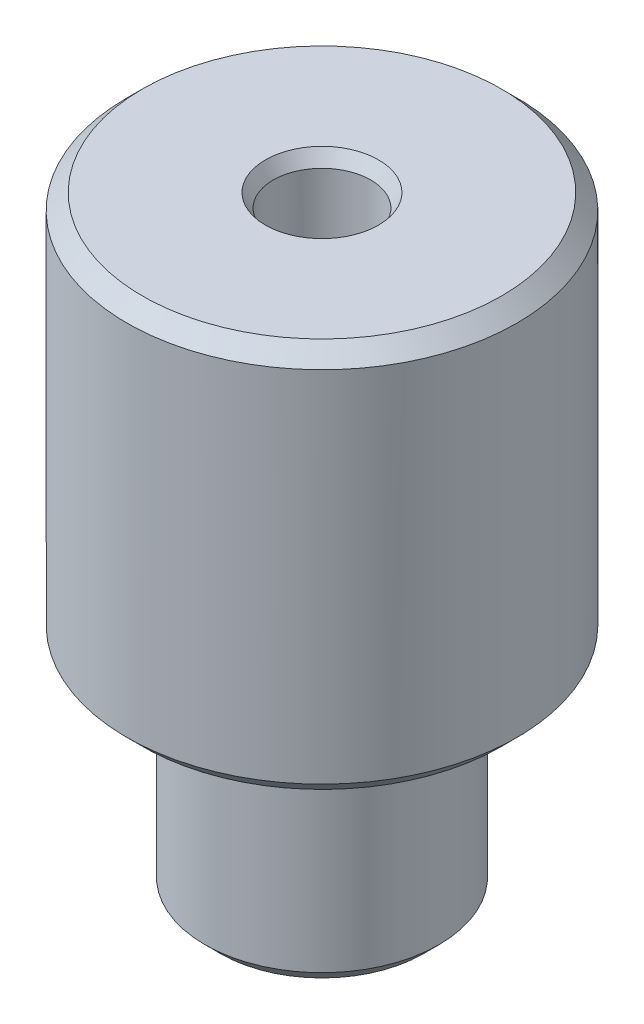
ISO-10303-21;
HEADER;
FILE_DESCRIPTION(('STEP AP214'),'2;1');
FILE_NAME('part.step','',(''),(''),'','','');
FILE_SCHEMA(('AUTOMOTIVE_DESIGN { 1 0 10303 214 1 1 1 1 }'));
ENDSEC;
DATA;
#1=APPLICATION_CONTEXT('core data for automotive mechanical design processes');
#2=APPLICATION_PROTOCOL_DEFINITION('international standard','automotive_design',2000,#1);
#3=PRODUCT_CONTEXT('',#1,'mechanical');
#4=PRODUCT('Part','Part','',(#3));
#5=PRODUCT_RELATED_PRODUCT_CATEGORY('part','',(#4));
#6=PRODUCT_DEFINITION_FORMATION('','',#4);
#7=PRODUCT_DEFINITION_CONTEXT('part definition',#1,'design');
#8=PRODUCT_DEFINITION('design','',#6,#7);
#9=PRODUCT_DEFINITION_SHAPE('','',#8);
#10=(LENGTH_UNIT() NAMED_UNIT(*) SI_UNIT(.MILLI.,.METRE.));
#11=(NAMED_UNIT(*) PLANE_ANGLE_UNIT() SI_UNIT($,.RADIAN.));
#12=(NAMED_UNIT(*) SI_UNIT($,.STERADIAN.) SOLID_ANGLE_UNIT());
#13=UNCERTAINTY_MEASURE_WITH_UNIT(LENGTH_MEASURE(1.E-05),#10,'distance_accuracy_value','');
#14=(GEOMETRIC_REPRESENTATION_CONTEXT(3) GLOBAL_UNCERTAINTY_ASSIGNED_CONTEXT((#13)) GLOBAL_UNIT_ASSIGNED_CONTEXT((#10,
#11,#12)) REPRESENTATION_CONTEXT('',''));
#15=CARTESIAN_POINT('',(0.,0.,0.));
#16=DIRECTION('',(0.,0.,1.));
#17=DIRECTION('',(1.,0.,0.));
#18=AXIS2_PLACEMENT_3D('',#15,#16,#17);
#19=CARTESIAN_POINT('',(0.,0.,0.));
#20=DIRECTION('',(0.,-1.,0.));
#21=DIRECTION('',(1.,0.,0.));
#22=AXIS2_PLACEMENT_3D('',#19,#20,#21);
#23=PLANE('',#22);
#24=CARTESIAN_POINT('',(0.,0.,0.));
#25=DIRECTION('',(0.,-1.,0.));
#26=DIRECTION('',(1.,0.,0.));
#27=AXIS2_PLACEMENT_3D('',#24,#25,#26);
#28=CIRCLE('',#27,7.25000000000001);
#29=CARTESIAN_POINT('',(7.25000000000001,0.,0.));
#30=VERTEX_POINT('',#29);
#31=EDGE_CURVE('E10',#30,#30,#28,.T.);
#32=ORIENTED_EDGE('',*,*,#31,.T.);
#33=EDGE_LOOP('',(#32));
#34=FACE_BOUND('',#33,.T.);
#35=CARTESIAN_POINT('',(0.,0.,0.));
#36=DIRECTION('',(0.,-1.,0.));
#37=DIRECTION('',(1.,0.,0.));
#38=AXIS2_PLACEMENT_3D('',#35,#36,#37);
#39=CIRCLE('',#38,23.);
#40=CARTESIAN_POINT('',(23.,0.,0.));
#41=VERTEX_POINT('',#40);
#42=EDGE_CURVE('E72',#41,#41,#39,.F.);
#43=ORIENTED_EDGE('',*,*,#42,.T.);
#44=EDGE_LOOP('',(#43));
#45=FACE_BOUND('',#44,.T.);
#46=ADVANCED_FACE('F51',(#34,#45),#23,.F.);
#47=CARTESIAN_POINT('',(0.,5.,0.));
#48=DIRECTION('',(0.,1.,0.));
#49=DIRECTION('',(-1.,0.,0.));
#50=AXIS2_PLACEMENT_3D('',#47,#48,#49);
#51=CYLINDRICAL_SURFACE('',#50,25.);
#52=CARTESIAN_POINT('',(0.,-48.,0.));
#53=DIRECTION('',(0.,1.,0.));
#54=DIRECTION('',(-1.,0.,0.));
#55=AXIS2_PLACEMENT_3D('',#52,#53,#54);
#56=CIRCLE('',#55,25.);
#57=CARTESIAN_POINT('',(-25.,-48.,0.));
#58=VERTEX_POINT('',#57);
#59=EDGE_CURVE('E78',#58,#58,#56,.T.);
#60=ORIENTED_EDGE('',*,*,#59,.T.);
#61=EDGE_LOOP('',(#60));
#62=FACE_BOUND('',#61,.T.);
#63=CARTESIAN_POINT('',(0.,-1.99999999999999,0.));
#64=DIRECTION('',(0.,-1.,0.));
#65=DIRECTION('',(1.,0.,0.));
#66=AXIS2_PLACEMENT_3D('',#63,#64,#65);
#67=CIRCLE('',#66,25.);
#68=CARTESIAN_POINT('',(25.,-1.99999999999999,0.));
#69=VERTEX_POINT('',#68);
#70=EDGE_CURVE('E81',#69,#69,#67,.T.);
#71=ORIENTED_EDGE('',*,*,#70,.T.);
#72=EDGE_LOOP('',(#71));
#73=FACE_BOUND('',#72,.T.);
#74=ADVANCED_FACE('F108',(#62,#73),#51,.T.);
#75=CARTESIAN_POINT('',(25.,-50.,0.));
#76=DIRECTION('',(0.,1.,0.));
#77=DIRECTION('',(-1.,0.,0.));
#78=AXIS2_PLACEMENT_3D('',#75,#76,#77);
#79=PLANE('',#78);
#80=CARTESIAN_POINT('',(0.,-50.,0.));
#81=DIRECTION('',(0.,1.,0.));
#82=DIRECTION('',(-1.,0.,0.));
#83=AXIS2_PLACEMENT_3D('',#80,#81,#82);
#84=CIRCLE('',#83,23.);
#85=CARTESIAN_POINT('',(-23.,-50.,0.));
#86=VERTEX_POINT('',#85);
#87=EDGE_CURVE('E75',#86,#86,#84,.F.);
#88=ORIENTED_EDGE('',*,*,#87,.T.);
#89=EDGE_LOOP('',(#88));
#90=FACE_BOUND('',#89,.T.);
#91=CARTESIAN_POINT('',(0.,-50.,0.));
#92=DIRECTION('',(0.,1.,0.));
#93=DIRECTION('',(-1.,0.,0.));
#94=AXIS2_PLACEMENT_3D('',#91,#92,#93);
#95=CIRCLE('',#94,15.);
#96=CARTESIAN_POINT('',(-15.,-50.,0.));
#97=VERTEX_POINT('',#96);
#98=EDGE_CURVE('E90',#97,#97,#95,.T.);
#99=ORIENTED_EDGE('',*,*,#98,.T.);
#100=EDGE_LOOP('',(#99));
#101=FACE_BOUND('',#100,.T.);
#102=ADVANCED_FACE('F94',(#90,#101),#79,.F.);
#103=CARTESIAN_POINT('',(0.,5.,0.));
#104=DIRECTION('',(0.,1.,0.));
#105=DIRECTION('',(-1.,0.,0.));
#106=AXIS2_PLACEMENT_3D('',#103,#104,#105);
#107=CYLINDRICAL_SURFACE('',#106,15.);
#108=CARTESIAN_POINT('',(0.,-76.,0.));
#109=DIRECTION('',(0.,1.,0.));
#110=DIRECTION('',(-1.,0.,0.));
#111=AXIS2_PLACEMENT_3D('',#108,#109,#110);
#112=CIRCLE('',#111,15.);
#113=CARTESIAN_POINT('',(-15.,-76.,0.));
#114=VERTEX_POINT('',#113);
#115=EDGE_CURVE('E87',#114,#114,#112,.T.);
#116=ORIENTED_EDGE('',*,*,#115,.T.);
#117=EDGE_LOOP('',(#116));
#118=FACE_BOUND('',#117,.T.);
#119=ORIENTED_EDGE('',*,*,#98,.F.);
#120=EDGE_LOOP('',(#119));
#121=FACE_BOUND('',#120,.T.);
#122=ADVANCED_FACE('F96',(#118,#121),#107,.T.);
#123=CARTESIAN_POINT('',(15.,-78.,0.));
#124=DIRECTION('',(0.,1.,0.));
#125=DIRECTION('',(-1.,0.,0.));
#126=AXIS2_PLACEMENT_3D('',#123,#124,#125);
#127=PLANE('',#126);
#128=CARTESIAN_POINT('',(0.,-78.,0.));
#129=DIRECTION('',(0.,1.,0.));
#130=DIRECTION('',(-1.,0.,0.));
#131=AXIS2_PLACEMENT_3D('',#128,#129,#130);
#132=CIRCLE('',#131,7.24999999999997);
#133=CARTESIAN_POINT('',(-7.24999999999997,-78.,0.));
#134=VERTEX_POINT('',#133);
#135=EDGE_CURVE('E67',#134,#134,#132,.T.);
#136=ORIENTED_EDGE('',*,*,#135,.T.);
#137=EDGE_LOOP('',(#136));
#138=FACE_BOUND('',#137,.T.);
#139=CARTESIAN_POINT('',(0.,-78.,0.));
#140=DIRECTION('',(0.,1.,0.));
#141=DIRECTION('',(-1.,0.,0.));
#142=AXIS2_PLACEMENT_3D('',#139,#140,#141);
#143=CIRCLE('',#142,13.);
#144=CARTESIAN_POINT('',(-13.,-78.,0.));
#145=VERTEX_POINT('',#144);
#146=EDGE_CURVE('E84',#145,#145,#143,.F.);
#147=ORIENTED_EDGE('',*,*,#146,.T.);
#148=EDGE_LOOP('',(#147));
#149=FACE_BOUND('',#148,.T.);
#150=ADVANCED_FACE('F98',(#138,#149),#127,.F.);
#151=CARTESIAN_POINT('',(0.,-76.,0.));
#152=DIRECTION('',(0.,1.,0.));
#153=DIRECTION('',(-1.,0.,0.));
#154=AXIS2_PLACEMENT_3D('',#151,#152,#153);
#155=CONICAL_SURFACE('',#154,15.,0.785398163397454);
#156=ORIENTED_EDGE('',*,*,#146,.F.);
#157=EDGE_LOOP('',(#156));
#158=FACE_BOUND('',#157,.T.);
#159=ORIENTED_EDGE('',*,*,#115,.F.);
#160=EDGE_LOOP('',(#159));
#161=FACE_BOUND('',#160,.T.);
#162=ADVANCED_FACE('F104',(#158,#161),#155,.T.);
#163=CARTESIAN_POINT('',(0.,-48.,0.));
#164=DIRECTION('',(0.,1.,0.));
#165=DIRECTION('',(-1.,0.,0.));
#166=AXIS2_PLACEMENT_3D('',#163,#164,#165);
#167=CONICAL_SURFACE('',#166,25.,0.785398163397449);
#168=ORIENTED_EDGE('',*,*,#87,.F.);
#169=EDGE_LOOP('',(#168));
#170=FACE_BOUND('',#169,.T.);
#171=ORIENTED_EDGE('',*,*,#59,.F.);
#172=EDGE_LOOP('',(#171));
#173=FACE_BOUND('',#172,.T.);
#174=ADVANCED_FACE('F127',(#170,#173),#167,.T.);
#175=CARTESIAN_POINT('',(0.,0.,0.));
#176=DIRECTION('',(0.,-1.,0.));
#177=DIRECTION('',(1.,0.,0.));
#178=AXIS2_PLACEMENT_3D('',#175,#176,#177);
#179=CONICAL_SURFACE('',#178,23.,0.785398163397444);
#180=ORIENTED_EDGE('',*,*,#70,.F.);
#181=EDGE_LOOP('',(#180));
#182=FACE_BOUND('',#181,.T.);
#183=ORIENTED_EDGE('',*,*,#42,.F.);
#184=EDGE_LOOP('',(#183));
#185=FACE_BOUND('',#184,.T.);
#186=ADVANCED_FACE('F134',(#182,#185),#179,.T.);
#187=CARTESIAN_POINT('',(0.,0.,0.));
#188=DIRECTION('',(0.,1.,0.));
#189=DIRECTION('',(0.,0.,1.));
#190=AXIS2_PLACEMENT_3D('',#187,#188,#189);
#191=CYLINDRICAL_SURFACE('',#190,6.24999999999999);
#192=CARTESIAN_POINT('',(0.,-76.2679491924311,0.));
#193=DIRECTION('',(0.,1.,0.));
#194=DIRECTION('',(0.,0.,1.));
#195=AXIS2_PLACEMENT_3D('',#192,#193,#194);
#196=CIRCLE('',#195,6.24999999999999);
#197=CARTESIAN_POINT('',(0.,-76.2679491924311,6.24999999999999));
#198=VERTEX_POINT('',#197);
#199=EDGE_CURVE('E59',#198,#198,#196,.F.);
#200=ORIENTED_EDGE('',*,*,#199,.T.);
#201=EDGE_LOOP('',(#200));
#202=FACE_BOUND('',#201,.T.);
#203=CARTESIAN_POINT('',(0.,-1.73205080756891,0.));
#204=DIRECTION('',(0.,-1.,0.));
#205=DIRECTION('',(0.,0.,-1.));
#206=AXIS2_PLACEMENT_3D('',#203,#204,#205);
#207=CIRCLE('',#206,6.24999999999999);
#208=CARTESIAN_POINT('',(0.,-1.73205080756891,-6.24999999999999));
#209=VERTEX_POINT('',#208);
#210=EDGE_CURVE('E63',#209,#209,#207,.F.);
#211=ORIENTED_EDGE('',*,*,#210,.T.);
#212=EDGE_LOOP('',(#211));
#213=FACE_BOUND('',#212,.T.);
#214=ADVANCED_FACE('F139',(#202,#213),#191,.F.);
#215=CARTESIAN_POINT('',(0.,-78.,0.));
#216=DIRECTION('',(0.,-1.,0.));
#217=DIRECTION('',(0.,0.,-1.));
#218=AXIS2_PLACEMENT_3D('',#215,#216,#217);
#219=CONICAL_SURFACE('',#218,7.24999999999996,0.523598775598294);
#220=ORIENTED_EDGE('',*,*,#199,.F.);
#221=EDGE_LOOP('',(#220));
#222=FACE_BOUND('',#221,.T.);
#223=ORIENTED_EDGE('',*,*,#135,.F.);
#224=EDGE_LOOP('',(#223));
#225=FACE_BOUND('',#224,.T.);
#226=ADVANCED_FACE('F141',(#222,#225),#219,.F.);
#227=CARTESIAN_POINT('',(0.,-1.73205080756891,0.));
#228=DIRECTION('',(0.,1.,0.));
#229=DIRECTION('',(0.,0.,1.));
#230=AXIS2_PLACEMENT_3D('',#227,#228,#229);
#231=CONICAL_SURFACE('',#230,6.24999999999999,0.523598775598303);
#232=ORIENTED_EDGE('',*,*,#31,.F.);
#233=EDGE_LOOP('',(#232));
#234=FACE_BOUND('',#233,.T.);
#235=ORIENTED_EDGE('',*,*,#210,.F.);
#236=EDGE_LOOP('',(#235));
#237=FACE_BOUND('',#236,.T.);
#238=ADVANCED_FACE('F54',(#234,#237),#231,.F.);
#239=CLOSED_SHELL('',(#46,#74,#102,#122,#150,#162,#174,#186,#214,#226,#238));
#240=MANIFOLD_SOLID_BREP('B2',#239);
#241=ADVANCED_BREP_SHAPE_REPRESENTATION('',(#18,#240),#14);
#242=SHAPE_DEFINITION_REPRESENTATION(#9,#241);
ENDSEC;
END-ISO-10303-21;
